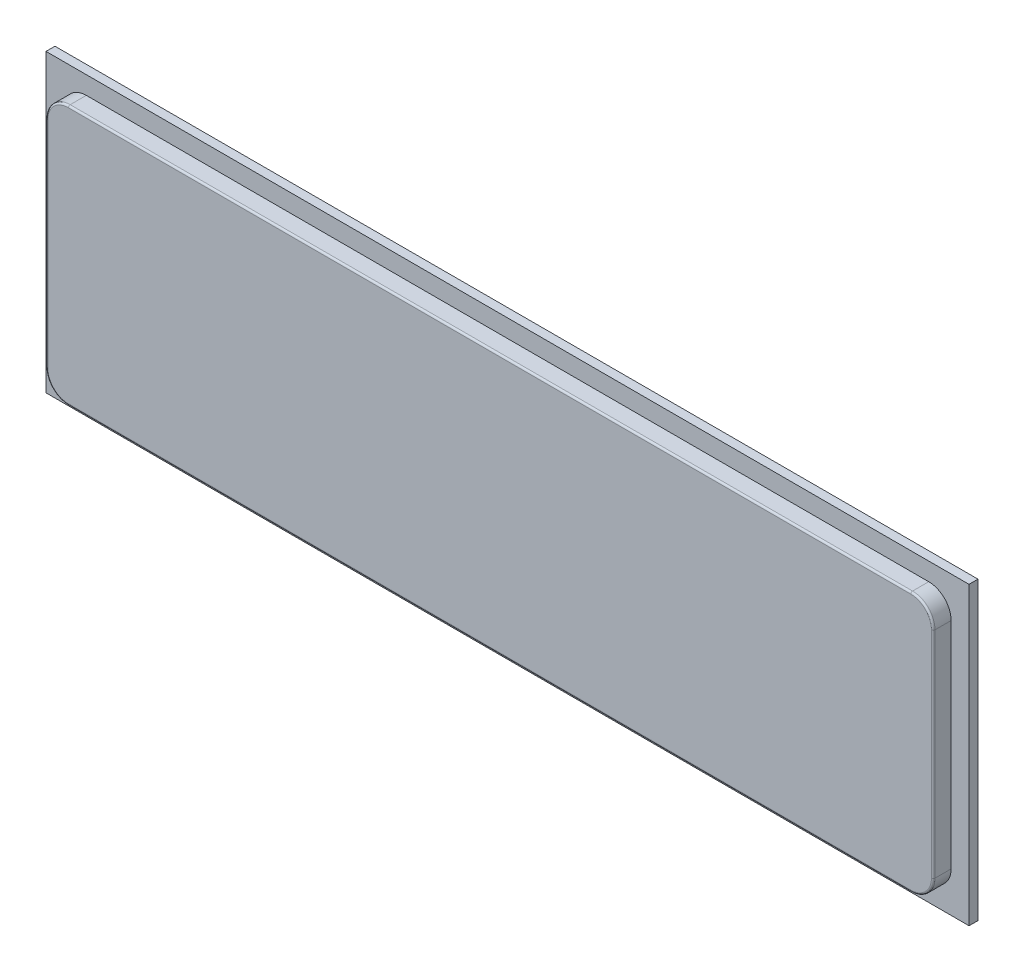
ISO-10303-21;
HEADER;
FILE_DESCRIPTION(('STEP AP214'),'2;1');
FILE_NAME('part.step','',(''),(''),'','','');
FILE_SCHEMA(('AUTOMOTIVE_DESIGN { 1 0 10303 214 1 1 1 1 }'));
ENDSEC;
DATA;
#1=APPLICATION_CONTEXT('core data for automotive mechanical design processes');
#2=APPLICATION_PROTOCOL_DEFINITION('international standard','automotive_design',2000,#1);
#3=PRODUCT_CONTEXT('',#1,'mechanical');
#4=PRODUCT('Part','Part','',(#3));
#5=PRODUCT_RELATED_PRODUCT_CATEGORY('part','',(#4));
#6=PRODUCT_DEFINITION_FORMATION('','',#4);
#7=PRODUCT_DEFINITION_CONTEXT('part definition',#1,'design');
#8=PRODUCT_DEFINITION('design','',#6,#7);
#9=PRODUCT_DEFINITION_SHAPE('','',#8);
#10=(LENGTH_UNIT() NAMED_UNIT(*) SI_UNIT(.MILLI.,.METRE.));
#11=(NAMED_UNIT(*) PLANE_ANGLE_UNIT() SI_UNIT($,.RADIAN.));
#12=(NAMED_UNIT(*) SI_UNIT($,.STERADIAN.) SOLID_ANGLE_UNIT());
#13=UNCERTAINTY_MEASURE_WITH_UNIT(LENGTH_MEASURE(1.E-05),#10,'distance_accuracy_value','');
#14=(GEOMETRIC_REPRESENTATION_CONTEXT(3) GLOBAL_UNCERTAINTY_ASSIGNED_CONTEXT((#13)) GLOBAL_UNIT_ASSIGNED_CONTEXT((#10,
#11,#12)) REPRESENTATION_CONTEXT('',''));
#15=CARTESIAN_POINT('',(0.,0.,0.));
#16=DIRECTION('',(0.,0.,1.));
#17=DIRECTION('',(1.,0.,0.));
#18=AXIS2_PLACEMENT_3D('',#15,#16,#17);
#19=CARTESIAN_POINT('',(-119.5,24.5,-2.));
#20=DIRECTION('',(-1.,0.,0.));
#21=DIRECTION('',(0.,0.,1.));
#22=AXIS2_PLACEMENT_3D('',#19,#20,#21);
#23=PLANE('',#22);
#24=DIRECTION('',(0.,0.,1.));
#25=VECTOR('',#24,1.);
#26=CARTESIAN_POINT('',(-119.5,-1.99999999999999,-2.));
#27=LINE('',#26,#25);
#28=CARTESIAN_POINT('',(-119.5,-1.99999999999999,-2.));
#29=VERTEX_POINT('',#28);
#30=CARTESIAN_POINT('',(-119.5,-1.99999999999999,-0.2));
#31=VERTEX_POINT('',#30);
#32=EDGE_CURVE('E224',#29,#31,#27,.T.);
#33=ORIENTED_EDGE('',*,*,#32,.T.);
#34=DIRECTION('',(0.,-1.,0.));
#35=VECTOR('',#34,1.);
#36=CARTESIAN_POINT('',(-119.5,24.5,-0.2));
#37=LINE('',#36,#35);
#38=CARTESIAN_POINT('',(-119.5,22.,-0.2));
#39=VERTEX_POINT('',#38);
#40=EDGE_CURVE('E252',#31,#39,#37,.F.);
#41=ORIENTED_EDGE('',*,*,#40,.T.);
#42=DIRECTION('',(0.,0.,1.));
#43=VECTOR('',#42,1.);
#44=CARTESIAN_POINT('',(-119.5,22.,-2.));
#45=LINE('',#44,#43);
#46=CARTESIAN_POINT('',(-119.5,22.,-2.));
#47=VERTEX_POINT('',#46);
#48=EDGE_CURVE('E222',#39,#47,#45,.F.);
#49=ORIENTED_EDGE('',*,*,#48,.T.);
#50=DIRECTION('',(0.,-1.,0.));
#51=VECTOR('',#50,1.);
#52=CARTESIAN_POINT('',(-119.5,24.5,-2.));
#53=LINE('',#52,#51);
#54=EDGE_CURVE('E189',#47,#29,#53,.T.);
#55=ORIENTED_EDGE('',*,*,#54,.T.);
#56=EDGE_LOOP('',(#33,#41,#49,#55));
#57=FACE_BOUND('',#56,.T.);
#58=ADVANCED_FACE('F35',(#57),#23,.T.);
#59=CARTESIAN_POINT('',(-119.5,24.5,-2.));
#60=DIRECTION('',(0.,-1.,0.));
#61=DIRECTION('',(1.,0.,0.));
#62=AXIS2_PLACEMENT_3D('',#59,#60,#61);
#63=PLANE('',#62);
#64=DIRECTION('',(0.,0.,1.));
#65=VECTOR('',#64,1.);
#66=CARTESIAN_POINT('',(-117.,24.5,0.));
#67=LINE('',#66,#65);
#68=CARTESIAN_POINT('',(-117.,24.5,-2.));
#69=VERTEX_POINT('',#68);
#70=CARTESIAN_POINT('',(-117.,24.5,-0.2));
#71=VERTEX_POINT('',#70);
#72=EDGE_CURVE('E229',#69,#71,#67,.T.);
#73=ORIENTED_EDGE('',*,*,#72,.T.);
#74=DIRECTION('',(1.,0.,0.));
#75=VECTOR('',#74,1.);
#76=CARTESIAN_POINT('',(-23.,24.5,-0.2));
#77=LINE('',#76,#75);
#78=CARTESIAN_POINT('',(-23.,24.5,-0.2));
#79=VERTEX_POINT('',#78);
#80=EDGE_CURVE('E256',#71,#79,#77,.T.);
#81=ORIENTED_EDGE('',*,*,#80,.T.);
#82=DIRECTION('',(0.,0.,1.));
#83=VECTOR('',#82,1.);
#84=CARTESIAN_POINT('',(-23.,24.5,-2.));
#85=LINE('',#84,#83);
#86=CARTESIAN_POINT('',(-23.,24.5,-2.));
#87=VERTEX_POINT('',#86);
#88=EDGE_CURVE('E227',#79,#87,#85,.F.);
#89=ORIENTED_EDGE('',*,*,#88,.T.);
#90=DIRECTION('',(1.,0.,0.));
#91=VECTOR('',#90,1.);
#92=CARTESIAN_POINT('',(-119.5,24.5,-2.));
#93=LINE('',#92,#91);
#94=EDGE_CURVE('E199',#69,#87,#93,.T.);
#95=ORIENTED_EDGE('',*,*,#94,.F.);
#96=EDGE_LOOP('',(#73,#81,#89,#95));
#97=FACE_BOUND('',#96,.T.);
#98=ADVANCED_FACE('F307',(#97),#63,.F.);
#99=CARTESIAN_POINT('',(-20.5,24.5,-2.));
#100=DIRECTION('',(-1.,0.,0.));
#101=DIRECTION('',(0.,-1.,0.));
#102=AXIS2_PLACEMENT_3D('',#99,#100,#101);
#103=PLANE('',#102);
#104=DIRECTION('',(0.,0.,1.));
#105=VECTOR('',#104,1.);
#106=CARTESIAN_POINT('',(-20.5,22.,-2.));
#107=LINE('',#106,#105);
#108=CARTESIAN_POINT('',(-20.5,22.,-2.));
#109=VERTEX_POINT('',#108);
#110=CARTESIAN_POINT('',(-20.5,22.,-0.2));
#111=VERTEX_POINT('',#110);
#112=EDGE_CURVE('E206',#109,#111,#107,.T.);
#113=ORIENTED_EDGE('',*,*,#112,.T.);
#114=DIRECTION('',(0.,-1.,0.));
#115=VECTOR('',#114,1.);
#116=CARTESIAN_POINT('',(-20.5,-1.99999999999998,-0.2));
#117=LINE('',#116,#115);
#118=CARTESIAN_POINT('',(-20.5,-1.99999999999999,-0.2));
#119=VERTEX_POINT('',#118);
#120=EDGE_CURVE('E59',#111,#119,#117,.T.);
#121=ORIENTED_EDGE('',*,*,#120,.T.);
#122=DIRECTION('',(0.,0.,1.));
#123=VECTOR('',#122,1.);
#124=CARTESIAN_POINT('',(-20.5,-1.99999999999999,-2.));
#125=LINE('',#124,#123);
#126=CARTESIAN_POINT('',(-20.5,-1.99999999999998,-2.));
#127=VERTEX_POINT('',#126);
#128=EDGE_CURVE('E208',#119,#127,#125,.F.);
#129=ORIENTED_EDGE('',*,*,#128,.T.);
#130=DIRECTION('',(0.,-1.,0.));
#131=VECTOR('',#130,1.);
#132=CARTESIAN_POINT('',(-20.5,24.5,-2.));
#133=LINE('',#132,#131);
#134=EDGE_CURVE('E196',#109,#127,#133,.T.);
#135=ORIENTED_EDGE('',*,*,#134,.F.);
#136=EDGE_LOOP('',(#113,#121,#129,#135));
#137=FACE_BOUND('',#136,.T.);
#138=ADVANCED_FACE('F297',(#137),#103,.F.);
#139=CARTESIAN_POINT('',(-119.5,-4.49999999999999,-2.));
#140=DIRECTION('',(0.,-1.,0.));
#141=DIRECTION('',(1.,0.,0.));
#142=AXIS2_PLACEMENT_3D('',#139,#140,#141);
#143=PLANE('',#142);
#144=DIRECTION('',(0.,0.,1.));
#145=VECTOR('',#144,1.);
#146=CARTESIAN_POINT('',(-23.,-4.49999999999999,0.));
#147=LINE('',#146,#145);
#148=CARTESIAN_POINT('',(-23.,-4.49999999999999,-2.));
#149=VERTEX_POINT('',#148);
#150=CARTESIAN_POINT('',(-23.,-4.49999999999999,-0.2));
#151=VERTEX_POINT('',#150);
#152=EDGE_CURVE('E204',#149,#151,#147,.T.);
#153=ORIENTED_EDGE('',*,*,#152,.T.);
#154=DIRECTION('',(1.,0.,0.));
#155=VECTOR('',#154,1.);
#156=CARTESIAN_POINT('',(-119.5,-4.49999999999999,-0.2));
#157=LINE('',#156,#155);
#158=CARTESIAN_POINT('',(-117.,-4.49999999999999,-0.2));
#159=VERTEX_POINT('',#158);
#160=EDGE_CURVE('E11',#151,#159,#157,.F.);
#161=ORIENTED_EDGE('',*,*,#160,.T.);
#162=DIRECTION('',(0.,0.,1.));
#163=VECTOR('',#162,1.);
#164=CARTESIAN_POINT('',(-117.,-4.49999999999999,-2.));
#165=LINE('',#164,#163);
#166=CARTESIAN_POINT('',(-117.,-4.49999999999999,-2.));
#167=VERTEX_POINT('',#166);
#168=EDGE_CURVE('E202',#159,#167,#165,.F.);
#169=ORIENTED_EDGE('',*,*,#168,.T.);
#170=DIRECTION('',(1.,0.,0.));
#171=VECTOR('',#170,1.);
#172=CARTESIAN_POINT('',(-119.5,-4.49999999999999,-2.));
#173=LINE('',#172,#171);
#174=EDGE_CURVE('E194',#167,#149,#173,.T.);
#175=ORIENTED_EDGE('',*,*,#174,.T.);
#176=EDGE_LOOP('',(#153,#161,#169,#175));
#177=FACE_BOUND('',#176,.T.);
#178=ADVANCED_FACE('F337',(#177),#143,.T.);
#179=CARTESIAN_POINT('',(0.,0.,0.));
#180=DIRECTION('',(0.,0.,1.));
#181=DIRECTION('',(1.,0.,0.));
#182=AXIS2_PLACEMENT_3D('',#179,#180,#181);
#183=PLANE('',#182);
#184=DIRECTION('',(0.,-1.,0.));
#185=VECTOR('',#184,1.);
#186=CARTESIAN_POINT('',(-119.3,0.,0.));
#187=LINE('',#186,#185);
#188=CARTESIAN_POINT('',(-119.3,22.,0.));
#189=VERTEX_POINT('',#188);
#190=CARTESIAN_POINT('',(-119.3,-1.99999999999999,0.));
#191=VERTEX_POINT('',#190);
#192=EDGE_CURVE('E244',#189,#191,#187,.T.);
#193=ORIENTED_EDGE('',*,*,#192,.T.);
#194=CARTESIAN_POINT('',(-117.,-1.99999999999999,0.));
#195=DIRECTION('',(0.,0.,1.));
#196=DIRECTION('',(1.,0.,0.));
#197=AXIS2_PLACEMENT_3D('',#194,#195,#196);
#198=CIRCLE('',#197,2.3);
#199=CARTESIAN_POINT('',(-117.,-4.29999999999999,0.));
#200=VERTEX_POINT('',#199);
#201=EDGE_CURVE('E246',#191,#200,#198,.T.);
#202=ORIENTED_EDGE('',*,*,#201,.T.);
#203=DIRECTION('',(1.,0.,0.));
#204=VECTOR('',#203,1.);
#205=CARTESIAN_POINT('',(0.,-4.29999999999999,0.));
#206=LINE('',#205,#204);
#207=CARTESIAN_POINT('',(-23.,-4.29999999999999,0.));
#208=VERTEX_POINT('',#207);
#209=EDGE_CURVE('E232',#200,#208,#206,.T.);
#210=ORIENTED_EDGE('',*,*,#209,.T.);
#211=CARTESIAN_POINT('',(-23.,-1.99999999999999,0.));
#212=DIRECTION('',(0.,0.,1.));
#213=DIRECTION('',(1.,0.,0.));
#214=AXIS2_PLACEMENT_3D('',#211,#212,#213);
#215=CIRCLE('',#214,2.3);
#216=CARTESIAN_POINT('',(-20.7,-1.99999999999999,0.));
#217=VERTEX_POINT('',#216);
#218=EDGE_CURVE('E234',#208,#217,#215,.T.);
#219=ORIENTED_EDGE('',*,*,#218,.T.);
#220=DIRECTION('',(0.,-1.,0.));
#221=VECTOR('',#220,1.);
#222=CARTESIAN_POINT('',(-20.7,22.,0.));
#223=LINE('',#222,#221);
#224=CARTESIAN_POINT('',(-20.7,22.,0.));
#225=VERTEX_POINT('',#224);
#226=EDGE_CURVE('E236',#217,#225,#223,.F.);
#227=ORIENTED_EDGE('',*,*,#226,.T.);
#228=CARTESIAN_POINT('',(-23.,22.,0.));
#229=DIRECTION('',(0.,0.,1.));
#230=DIRECTION('',(1.,0.,0.));
#231=AXIS2_PLACEMENT_3D('',#228,#229,#230);
#232=CIRCLE('',#231,2.3);
#233=CARTESIAN_POINT('',(-23.,24.3,0.));
#234=VERTEX_POINT('',#233);
#235=EDGE_CURVE('E238',#225,#234,#232,.T.);
#236=ORIENTED_EDGE('',*,*,#235,.T.);
#237=DIRECTION('',(1.,0.,0.));
#238=VECTOR('',#237,1.);
#239=CARTESIAN_POINT('',(-117.,24.3,0.));
#240=LINE('',#239,#238);
#241=CARTESIAN_POINT('',(-117.,24.3,0.));
#242=VERTEX_POINT('',#241);
#243=EDGE_CURVE('E240',#234,#242,#240,.F.);
#244=ORIENTED_EDGE('',*,*,#243,.T.);
#245=CARTESIAN_POINT('',(-117.,22.,0.));
#246=DIRECTION('',(0.,0.,1.));
#247=DIRECTION('',(1.,0.,0.));
#248=AXIS2_PLACEMENT_3D('',#245,#246,#247);
#249=CIRCLE('',#248,2.3);
#250=EDGE_CURVE('E242',#242,#189,#249,.T.);
#251=ORIENTED_EDGE('',*,*,#250,.T.);
#252=EDGE_LOOP('',(#193,#202,#210,#219,#227,#236,#244,#251));
#253=FACE_BOUND('',#252,.T.);
#254=ADVANCED_FACE('F323',(#253),#183,.T.);
#255=CARTESIAN_POINT('',(-23.,-1.99999999999999,-2.));
#256=DIRECTION('',(0.,0.,-1.));
#257=DIRECTION('',(-1.,0.,0.));
#258=AXIS2_PLACEMENT_3D('',#255,#256,#257);
#259=CYLINDRICAL_SURFACE('',#258,2.5);
#260=ORIENTED_EDGE('',*,*,#128,.F.);
#261=CARTESIAN_POINT('',(-23.,-1.99999999999999,-0.2));
#262=DIRECTION('',(0.,0.,1.));
#263=DIRECTION('',(1.,0.,0.));
#264=AXIS2_PLACEMENT_3D('',#261,#262,#263);
#265=CIRCLE('',#264,2.5);
#266=EDGE_CURVE('E44',#119,#151,#265,.F.);
#267=ORIENTED_EDGE('',*,*,#266,.T.);
#268=ORIENTED_EDGE('',*,*,#152,.F.);
#269=CARTESIAN_POINT('',(-23.,-1.99999999999999,-2.));
#270=DIRECTION('',(0.,0.,1.));
#271=DIRECTION('',(1.,0.,0.));
#272=AXIS2_PLACEMENT_3D('',#269,#270,#271);
#273=CIRCLE('',#272,2.5);
#274=EDGE_CURVE('E219',#127,#149,#273,.F.);
#275=ORIENTED_EDGE('',*,*,#274,.F.);
#276=EDGE_LOOP('',(#260,#267,#268,#275));
#277=FACE_BOUND('',#276,.T.);
#278=ADVANCED_FACE('F362',(#277),#259,.T.);
#279=CARTESIAN_POINT('',(-117.,-1.99999999999999,-2.));
#280=DIRECTION('',(0.,0.,1.));
#281=DIRECTION('',(1.,0.,0.));
#282=AXIS2_PLACEMENT_3D('',#279,#280,#281);
#283=CYLINDRICAL_SURFACE('',#282,2.5);
#284=ORIENTED_EDGE('',*,*,#168,.F.);
#285=CARTESIAN_POINT('',(-117.,-1.99999999999999,-0.2));
#286=DIRECTION('',(0.,0.,1.));
#287=DIRECTION('',(1.,0.,0.));
#288=AXIS2_PLACEMENT_3D('',#285,#286,#287);
#289=CIRCLE('',#288,2.5);
#290=EDGE_CURVE('E249',#159,#31,#289,.F.);
#291=ORIENTED_EDGE('',*,*,#290,.T.);
#292=ORIENTED_EDGE('',*,*,#32,.F.);
#293=CARTESIAN_POINT('',(-117.,-1.99999999999999,-2.));
#294=DIRECTION('',(0.,0.,1.));
#295=DIRECTION('',(1.,0.,0.));
#296=AXIS2_PLACEMENT_3D('',#293,#294,#295);
#297=CIRCLE('',#296,2.5);
#298=EDGE_CURVE('E216',#167,#29,#297,.F.);
#299=ORIENTED_EDGE('',*,*,#298,.F.);
#300=EDGE_LOOP('',(#284,#291,#292,#299));
#301=FACE_BOUND('',#300,.T.);
#302=ADVANCED_FACE('F341',(#301),#283,.T.);
#303=CARTESIAN_POINT('',(-117.,22.,-2.));
#304=DIRECTION('',(0.,0.,-1.));
#305=DIRECTION('',(-1.,0.,0.));
#306=AXIS2_PLACEMENT_3D('',#303,#304,#305);
#307=CYLINDRICAL_SURFACE('',#306,2.5);
#308=ORIENTED_EDGE('',*,*,#48,.F.);
#309=CARTESIAN_POINT('',(-117.,22.,-0.2));
#310=DIRECTION('',(0.,0.,1.));
#311=DIRECTION('',(1.,0.,0.));
#312=AXIS2_PLACEMENT_3D('',#309,#310,#311);
#313=CIRCLE('',#312,2.5);
#314=EDGE_CURVE('E254',#39,#71,#313,.F.);
#315=ORIENTED_EDGE('',*,*,#314,.T.);
#316=ORIENTED_EDGE('',*,*,#72,.F.);
#317=CARTESIAN_POINT('',(-117.,22.,-2.));
#318=DIRECTION('',(0.,0.,1.));
#319=DIRECTION('',(1.,0.,0.));
#320=AXIS2_PLACEMENT_3D('',#317,#318,#319);
#321=CIRCLE('',#320,2.5);
#322=EDGE_CURVE('E213',#47,#69,#321,.F.);
#323=ORIENTED_EDGE('',*,*,#322,.F.);
#324=EDGE_LOOP('',(#308,#315,#316,#323));
#325=FACE_BOUND('',#324,.T.);
#326=ADVANCED_FACE('F310',(#325),#307,.T.);
#327=CARTESIAN_POINT('',(-23.,22.,-2.));
#328=DIRECTION('',(0.,0.,1.));
#329=DIRECTION('',(1.,0.,0.));
#330=AXIS2_PLACEMENT_3D('',#327,#328,#329);
#331=CYLINDRICAL_SURFACE('',#330,2.5);
#332=ORIENTED_EDGE('',*,*,#88,.F.);
#333=CARTESIAN_POINT('',(-23.,22.,-0.2));
#334=DIRECTION('',(0.,0.,1.));
#335=DIRECTION('',(1.,0.,0.));
#336=AXIS2_PLACEMENT_3D('',#333,#334,#335);
#337=CIRCLE('',#336,2.5);
#338=EDGE_CURVE('E258',#79,#111,#337,.F.);
#339=ORIENTED_EDGE('',*,*,#338,.T.);
#340=ORIENTED_EDGE('',*,*,#112,.F.);
#341=CARTESIAN_POINT('',(-23.,22.,-2.));
#342=DIRECTION('',(0.,0.,1.));
#343=DIRECTION('',(1.,0.,0.));
#344=AXIS2_PLACEMENT_3D('',#341,#342,#343);
#345=CIRCLE('',#344,2.5);
#346=EDGE_CURVE('E210',#87,#109,#345,.F.);
#347=ORIENTED_EDGE('',*,*,#346,.F.);
#348=EDGE_LOOP('',(#332,#339,#340,#347));
#349=FACE_BOUND('',#348,.T.);
#350=ADVANCED_FACE('F294',(#349),#331,.T.);
#351=CARTESIAN_POINT('',(-121.5,26.5,-3.));
#352=DIRECTION('',(-1.,0.,0.));
#353=DIRECTION('',(0.,0.,1.));
#354=AXIS2_PLACEMENT_3D('',#351,#352,#353);
#355=PLANE('',#354);
#356=DIRECTION('',(0.,-1.,0.));
#357=VECTOR('',#356,1.);
#358=CARTESIAN_POINT('',(-121.5,26.5,-2.));
#359=LINE('',#358,#357);
#360=CARTESIAN_POINT('',(-121.5,26.5,-2.));
#361=VERTEX_POINT('',#360);
#362=CARTESIAN_POINT('',(-121.5,-6.49999999999999,-2.));
#363=VERTEX_POINT('',#362);
#364=EDGE_CURVE('E183',#361,#363,#359,.T.);
#365=ORIENTED_EDGE('',*,*,#364,.F.);
#366=DIRECTION('',(0.,0.,1.));
#367=VECTOR('',#366,1.);
#368=CARTESIAN_POINT('',(-121.5,26.5,-3.));
#369=LINE('',#368,#367);
#370=CARTESIAN_POINT('',(-121.5,26.5,-3.));
#371=VERTEX_POINT('',#370);
#372=EDGE_CURVE('E174',#371,#361,#369,.T.);
#373=ORIENTED_EDGE('',*,*,#372,.F.);
#374=DIRECTION('',(0.,-1.,0.));
#375=VECTOR('',#374,1.);
#376=CARTESIAN_POINT('',(-121.5,26.5,-3.));
#377=LINE('',#376,#375);
#378=CARTESIAN_POINT('',(-121.5,-6.49999999999999,-3.));
#379=VERTEX_POINT('',#378);
#380=EDGE_CURVE('E168',#371,#379,#377,.T.);
#381=ORIENTED_EDGE('',*,*,#380,.T.);
#382=DIRECTION('',(0.,0.,1.));
#383=VECTOR('',#382,1.);
#384=CARTESIAN_POINT('',(-121.5,-6.49999999999999,-3.));
#385=LINE('',#384,#383);
#386=EDGE_CURVE('E150',#379,#363,#385,.T.);
#387=ORIENTED_EDGE('',*,*,#386,.T.);
#388=EDGE_LOOP('',(#365,#373,#381,#387));
#389=FACE_BOUND('',#388,.T.);
#390=ADVANCED_FACE('F173',(#389),#355,.T.);
#391=CARTESIAN_POINT('',(-121.5,26.5,-3.));
#392=DIRECTION('',(0.,1.,0.));
#393=DIRECTION('',(0.,0.,1.));
#394=AXIS2_PLACEMENT_3D('',#391,#392,#393);
#395=PLANE('',#394);
#396=DIRECTION('',(-1.,0.,0.));
#397=VECTOR('',#396,1.);
#398=CARTESIAN_POINT('',(-121.5,26.5,-2.));
#399=LINE('',#398,#397);
#400=CARTESIAN_POINT('',(-18.5,26.5,-2.));
#401=VERTEX_POINT('',#400);
#402=EDGE_CURVE('E175',#401,#361,#399,.T.);
#403=ORIENTED_EDGE('',*,*,#402,.F.);
#404=DIRECTION('',(0.,0.,1.));
#405=VECTOR('',#404,1.);
#406=CARTESIAN_POINT('',(-18.5,26.5,-3.));
#407=LINE('',#406,#405);
#408=CARTESIAN_POINT('',(-18.5,26.5,-3.));
#409=VERTEX_POINT('',#408);
#410=EDGE_CURVE('E190',#409,#401,#407,.T.);
#411=ORIENTED_EDGE('',*,*,#410,.F.);
#412=DIRECTION('',(-1.,0.,0.));
#413=VECTOR('',#412,1.);
#414=CARTESIAN_POINT('',(-121.5,26.5,-3.));
#415=LINE('',#414,#413);
#416=EDGE_CURVE('E161',#409,#371,#415,.T.);
#417=ORIENTED_EDGE('',*,*,#416,.T.);
#418=ORIENTED_EDGE('',*,*,#372,.T.);
#419=EDGE_LOOP('',(#403,#411,#417,#418));
#420=FACE_BOUND('',#419,.T.);
#421=ADVANCED_FACE('F372',(#420),#395,.T.);
#422=CARTESIAN_POINT('',(-18.5,26.5,-3.));
#423=DIRECTION('',(1.,0.,0.));
#424=DIRECTION('',(0.,1.,0.));
#425=AXIS2_PLACEMENT_3D('',#422,#423,#424);
#426=PLANE('',#425);
#427=DIRECTION('',(0.,1.,0.));
#428=VECTOR('',#427,1.);
#429=CARTESIAN_POINT('',(-18.5,26.5,-2.));
#430=LINE('',#429,#428);
#431=CARTESIAN_POINT('',(-18.5,-6.49999999999999,-2.));
#432=VERTEX_POINT('',#431);
#433=EDGE_CURVE('E178',#432,#401,#430,.T.);
#434=ORIENTED_EDGE('',*,*,#433,.F.);
#435=DIRECTION('',(0.,0.,1.));
#436=VECTOR('',#435,1.);
#437=CARTESIAN_POINT('',(-18.5,-6.49999999999999,-3.));
#438=LINE('',#437,#436);
#439=CARTESIAN_POINT('',(-18.5,-6.49999999999999,-3.));
#440=VERTEX_POINT('',#439);
#441=EDGE_CURVE('E160',#440,#432,#438,.T.);
#442=ORIENTED_EDGE('',*,*,#441,.F.);
#443=DIRECTION('',(0.,1.,0.));
#444=VECTOR('',#443,1.);
#445=CARTESIAN_POINT('',(-18.5,26.5,-3.));
#446=LINE('',#445,#444);
#447=EDGE_CURVE('E171',#440,#409,#446,.T.);
#448=ORIENTED_EDGE('',*,*,#447,.T.);
#449=ORIENTED_EDGE('',*,*,#410,.T.);
#450=EDGE_LOOP('',(#434,#442,#448,#449));
#451=FACE_BOUND('',#450,.T.);
#452=ADVANCED_FACE('F377',(#451),#426,.T.);
#453=CARTESIAN_POINT('',(-121.5,-6.49999999999999,-3.));
#454=DIRECTION('',(0.,-1.,0.));
#455=DIRECTION('',(1.,0.,0.));
#456=AXIS2_PLACEMENT_3D('',#453,#454,#455);
#457=PLANE('',#456);
#458=DIRECTION('',(1.,0.,0.));
#459=VECTOR('',#458,1.);
#460=CARTESIAN_POINT('',(-121.5,-6.49999999999999,-2.));
#461=LINE('',#460,#459);
#462=EDGE_CURVE('E155',#363,#432,#461,.T.);
#463=ORIENTED_EDGE('',*,*,#462,.F.);
#464=ORIENTED_EDGE('',*,*,#386,.F.);
#465=DIRECTION('',(1.,0.,0.));
#466=VECTOR('',#465,1.);
#467=CARTESIAN_POINT('',(-121.5,-6.49999999999999,-3.));
#468=LINE('',#467,#466);
#469=EDGE_CURVE('E153',#379,#440,#468,.T.);
#470=ORIENTED_EDGE('',*,*,#469,.T.);
#471=ORIENTED_EDGE('',*,*,#441,.T.);
#472=EDGE_LOOP('',(#463,#464,#470,#471));
#473=FACE_BOUND('',#472,.T.);
#474=ADVANCED_FACE('F152',(#473),#457,.T.);
#475=CARTESIAN_POINT('',(0.,0.,-3.));
#476=DIRECTION('',(0.,0.,1.));
#477=DIRECTION('',(1.,0.,0.));
#478=AXIS2_PLACEMENT_3D('',#475,#476,#477);
#479=PLANE('',#478);
#480=ORIENTED_EDGE('',*,*,#380,.F.);
#481=ORIENTED_EDGE('',*,*,#416,.F.);
#482=ORIENTED_EDGE('',*,*,#447,.F.);
#483=ORIENTED_EDGE('',*,*,#469,.F.);
#484=EDGE_LOOP('',(#480,#481,#482,#483));
#485=FACE_BOUND('',#484,.T.);
#486=ADVANCED_FACE('F166',(#485),#479,.F.);
#487=CARTESIAN_POINT('',(0.,0.,-2.));
#488=DIRECTION('',(0.,0.,1.));
#489=DIRECTION('',(1.,0.,0.));
#490=AXIS2_PLACEMENT_3D('',#487,#488,#489);
#491=PLANE('',#490);
#492=ORIENTED_EDGE('',*,*,#174,.F.);
#493=ORIENTED_EDGE('',*,*,#298,.T.);
#494=ORIENTED_EDGE('',*,*,#54,.F.);
#495=ORIENTED_EDGE('',*,*,#322,.T.);
#496=ORIENTED_EDGE('',*,*,#94,.T.);
#497=ORIENTED_EDGE('',*,*,#346,.T.);
#498=ORIENTED_EDGE('',*,*,#134,.T.);
#499=ORIENTED_EDGE('',*,*,#274,.T.);
#500=EDGE_LOOP('',(#492,#493,#494,#495,#496,#497,#498,#499));
#501=FACE_BOUND('',#500,.T.);
#502=ORIENTED_EDGE('',*,*,#364,.T.);
#503=ORIENTED_EDGE('',*,*,#462,.T.);
#504=ORIENTED_EDGE('',*,*,#433,.T.);
#505=ORIENTED_EDGE('',*,*,#402,.T.);
#506=EDGE_LOOP('',(#502,#503,#504,#505));
#507=FACE_BOUND('',#506,.T.);
#508=ADVANCED_FACE('F301',(#501,#507),#491,.T.);
#509=CARTESIAN_POINT('',(-23.,22.,-0.2));
#510=DIRECTION('',(0.,0.,1.));
#511=DIRECTION('',(1.,0.,0.));
#512=AXIS2_PLACEMENT_3D('',#509,#510,#511);
#513=TOROIDAL_SURFACE('',#512,2.3,0.2);
#514=CARTESIAN_POINT('',(-20.7,22.,-0.2));
#515=DIRECTION('',(0.,-1.,0.));
#516=DIRECTION('',(0.,0.,-1.));
#517=AXIS2_PLACEMENT_3D('',#514,#515,#516);
#518=CIRCLE('',#517,0.2);
#519=EDGE_CURVE('E277',#111,#225,#518,.T.);
#520=ORIENTED_EDGE('',*,*,#519,.F.);
#521=ORIENTED_EDGE('',*,*,#338,.F.);
#522=CARTESIAN_POINT('',(-23.,24.3,-0.2));
#523=DIRECTION('',(-1.,0.,0.));
#524=DIRECTION('',(0.,0.,1.));
#525=AXIS2_PLACEMENT_3D('',#522,#523,#524);
#526=CIRCLE('',#525,0.2);
#527=EDGE_CURVE('E39',#234,#79,#526,.T.);
#528=ORIENTED_EDGE('',*,*,#527,.F.);
#529=ORIENTED_EDGE('',*,*,#235,.F.);
#530=EDGE_LOOP('',(#520,#521,#528,#529));
#531=FACE_BOUND('',#530,.T.);
#532=ADVANCED_FACE('F37',(#531),#513,.T.);
#533=CARTESIAN_POINT('',(-119.5,24.3,-0.2));
#534=DIRECTION('',(-1.,0.,0.));
#535=DIRECTION('',(0.,-1.,0.));
#536=AXIS2_PLACEMENT_3D('',#533,#534,#535);
#537=CYLINDRICAL_SURFACE('',#536,0.2);
#538=ORIENTED_EDGE('',*,*,#527,.T.);
#539=ORIENTED_EDGE('',*,*,#80,.F.);
#540=CARTESIAN_POINT('',(-117.,24.3,-0.2));
#541=DIRECTION('',(-1.,0.,0.));
#542=DIRECTION('',(0.,0.,1.));
#543=AXIS2_PLACEMENT_3D('',#540,#541,#542);
#544=CIRCLE('',#543,0.2);
#545=EDGE_CURVE('E275',#242,#71,#544,.T.);
#546=ORIENTED_EDGE('',*,*,#545,.F.);
#547=ORIENTED_EDGE('',*,*,#243,.F.);
#548=EDGE_LOOP('',(#538,#539,#546,#547));
#549=FACE_BOUND('',#548,.T.);
#550=ADVANCED_FACE('F287',(#549),#537,.T.);
#551=CARTESIAN_POINT('',(-20.7,24.5,-0.2));
#552=DIRECTION('',(0.,1.,0.));
#553=DIRECTION('',(-1.,0.,0.));
#554=AXIS2_PLACEMENT_3D('',#551,#552,#553);
#555=CYLINDRICAL_SURFACE('',#554,0.2);
#556=ORIENTED_EDGE('',*,*,#519,.T.);
#557=ORIENTED_EDGE('',*,*,#226,.F.);
#558=CARTESIAN_POINT('',(-20.7,-1.99999999999999,-0.2));
#559=DIRECTION('',(0.,-1.,0.));
#560=DIRECTION('',(0.,0.,-1.));
#561=AXIS2_PLACEMENT_3D('',#558,#559,#560);
#562=CIRCLE('',#561,0.2);
#563=EDGE_CURVE('E272',#119,#217,#562,.T.);
#564=ORIENTED_EDGE('',*,*,#563,.F.);
#565=ORIENTED_EDGE('',*,*,#120,.F.);
#566=EDGE_LOOP('',(#556,#557,#564,#565));
#567=FACE_BOUND('',#566,.T.);
#568=ADVANCED_FACE('F326',(#567),#555,.T.);
#569=CARTESIAN_POINT('',(-117.,22.,-0.2));
#570=DIRECTION('',(0.,0.,1.));
#571=DIRECTION('',(1.,0.,0.));
#572=AXIS2_PLACEMENT_3D('',#569,#570,#571);
#573=TOROIDAL_SURFACE('',#572,2.3,0.2);
#574=ORIENTED_EDGE('',*,*,#545,.T.);
#575=ORIENTED_EDGE('',*,*,#314,.F.);
#576=CARTESIAN_POINT('',(-119.3,22.,-0.2));
#577=DIRECTION('',(0.,-1.,0.));
#578=DIRECTION('',(0.,0.,-1.));
#579=AXIS2_PLACEMENT_3D('',#576,#577,#578);
#580=CIRCLE('',#579,0.2);
#581=EDGE_CURVE('E269',#189,#39,#580,.T.);
#582=ORIENTED_EDGE('',*,*,#581,.F.);
#583=ORIENTED_EDGE('',*,*,#250,.F.);
#584=EDGE_LOOP('',(#574,#575,#582,#583));
#585=FACE_BOUND('',#584,.T.);
#586=ADVANCED_FACE('F314',(#585),#573,.T.);
#587=CARTESIAN_POINT('',(-23.,-1.99999999999999,-0.2));
#588=DIRECTION('',(0.,0.,1.));
#589=DIRECTION('',(1.,0.,0.));
#590=AXIS2_PLACEMENT_3D('',#587,#588,#589);
#591=TOROIDAL_SURFACE('',#590,2.3,0.2);
#592=ORIENTED_EDGE('',*,*,#563,.T.);
#593=ORIENTED_EDGE('',*,*,#218,.F.);
#594=CARTESIAN_POINT('',(-23.,-4.29999999999999,-0.2));
#595=DIRECTION('',(-1.,0.,0.));
#596=DIRECTION('',(0.,0.,1.));
#597=AXIS2_PLACEMENT_3D('',#594,#595,#596);
#598=CIRCLE('',#597,0.2);
#599=EDGE_CURVE('E266',#151,#208,#598,.T.);
#600=ORIENTED_EDGE('',*,*,#599,.F.);
#601=ORIENTED_EDGE('',*,*,#266,.F.);
#602=EDGE_LOOP('',(#592,#593,#600,#601));
#603=FACE_BOUND('',#602,.T.);
#604=ADVANCED_FACE('F328',(#603),#591,.T.);
#605=CARTESIAN_POINT('',(-119.3,0.,-0.2));
#606=DIRECTION('',(0.,-1.,0.));
#607=DIRECTION('',(0.,0.,-1.));
#608=AXIS2_PLACEMENT_3D('',#605,#606,#607);
#609=CYLINDRICAL_SURFACE('',#608,0.2);
#610=ORIENTED_EDGE('',*,*,#581,.T.);
#611=ORIENTED_EDGE('',*,*,#40,.F.);
#612=CARTESIAN_POINT('',(-119.3,-1.99999999999999,-0.2));
#613=DIRECTION('',(0.,-1.,0.));
#614=DIRECTION('',(0.,0.,-1.));
#615=AXIS2_PLACEMENT_3D('',#612,#613,#614);
#616=CIRCLE('',#615,0.2);
#617=EDGE_CURVE('E264',#191,#31,#616,.T.);
#618=ORIENTED_EDGE('',*,*,#617,.F.);
#619=ORIENTED_EDGE('',*,*,#192,.F.);
#620=EDGE_LOOP('',(#610,#611,#618,#619));
#621=FACE_BOUND('',#620,.T.);
#622=ADVANCED_FACE('F319',(#621),#609,.T.);
#623=CARTESIAN_POINT('',(0.,-4.29999999999999,-0.2));
#624=DIRECTION('',(1.,0.,0.));
#625=DIRECTION('',(0.,1.,0.));
#626=AXIS2_PLACEMENT_3D('',#623,#624,#625);
#627=CYLINDRICAL_SURFACE('',#626,0.2);
#628=ORIENTED_EDGE('',*,*,#599,.T.);
#629=ORIENTED_EDGE('',*,*,#209,.F.);
#630=CARTESIAN_POINT('',(-117.,-4.29999999999999,-0.2));
#631=DIRECTION('',(-1.,0.,0.));
#632=DIRECTION('',(0.,0.,1.));
#633=AXIS2_PLACEMENT_3D('',#630,#631,#632);
#634=CIRCLE('',#633,0.2);
#635=EDGE_CURVE('E262',#159,#200,#634,.T.);
#636=ORIENTED_EDGE('',*,*,#635,.F.);
#637=ORIENTED_EDGE('',*,*,#160,.F.);
#638=EDGE_LOOP('',(#628,#629,#636,#637));
#639=FACE_BOUND('',#638,.T.);
#640=ADVANCED_FACE('F334',(#639),#627,.T.);
#641=CARTESIAN_POINT('',(-117.,-1.99999999999999,-0.2));
#642=DIRECTION('',(0.,0.,1.));
#643=DIRECTION('',(1.,0.,0.));
#644=AXIS2_PLACEMENT_3D('',#641,#642,#643);
#645=TOROIDAL_SURFACE('',#644,2.3,0.2);
#646=ORIENTED_EDGE('',*,*,#617,.T.);
#647=ORIENTED_EDGE('',*,*,#290,.F.);
#648=ORIENTED_EDGE('',*,*,#635,.T.);
#649=ORIENTED_EDGE('',*,*,#201,.F.);
#650=EDGE_LOOP('',(#646,#647,#648,#649));
#651=FACE_BOUND('',#650,.T.);
#652=ADVANCED_FACE('F344',(#651),#645,.T.);
#653=CLOSED_SHELL('',(#58,#98,#138,#178,#254,#278,#302,#326,#350,#390,#421,#452,#474,#486,#508,
#532,#550,#568,#586,#604,#622,#640,#652));
#654=MANIFOLD_SOLID_BREP('B2',#653);
#655=ADVANCED_BREP_SHAPE_REPRESENTATION('',(#18,#654),#14);
#656=SHAPE_DEFINITION_REPRESENTATION(#9,#655);
ENDSEC;
END-ISO-10303-21;
